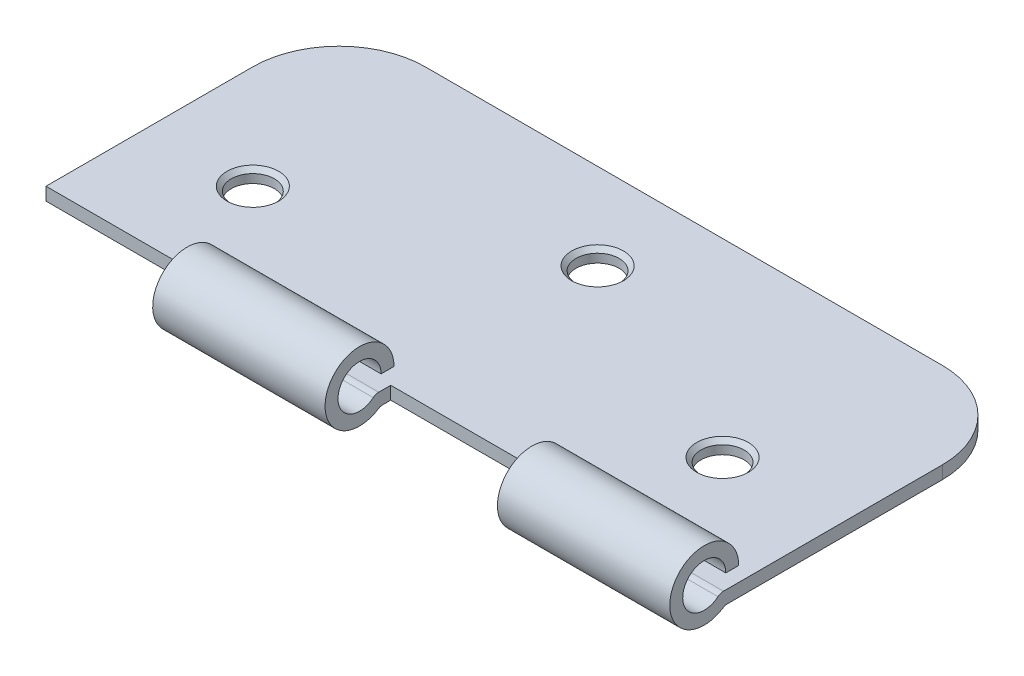
ISO-10303-21;
HEADER;
FILE_DESCRIPTION(('STEP AP214'),'2;1');
FILE_NAME('part.step','',(''),(''),'','','');
FILE_SCHEMA(('AUTOMOTIVE_DESIGN { 1 0 10303 214 1 1 1 1 }'));
ENDSEC;
DATA;
#1=APPLICATION_CONTEXT('core data for automotive mechanical design processes');
#2=APPLICATION_PROTOCOL_DEFINITION('international standard','automotive_design',2000,#1);
#3=PRODUCT_CONTEXT('',#1,'mechanical');
#4=PRODUCT('Part','Part','',(#3));
#5=PRODUCT_RELATED_PRODUCT_CATEGORY('part','',(#4));
#6=PRODUCT_DEFINITION_FORMATION('','',#4);
#7=PRODUCT_DEFINITION_CONTEXT('part definition',#1,'design');
#8=PRODUCT_DEFINITION('design','',#6,#7);
#9=PRODUCT_DEFINITION_SHAPE('','',#8);
#10=(LENGTH_UNIT() NAMED_UNIT(*) SI_UNIT(.MILLI.,.METRE.));
#11=(NAMED_UNIT(*) PLANE_ANGLE_UNIT() SI_UNIT($,.RADIAN.));
#12=(NAMED_UNIT(*) SI_UNIT($,.STERADIAN.) SOLID_ANGLE_UNIT());
#13=UNCERTAINTY_MEASURE_WITH_UNIT(LENGTH_MEASURE(1.E-05),#10,'distance_accuracy_value','');
#14=(GEOMETRIC_REPRESENTATION_CONTEXT(3) GLOBAL_UNCERTAINTY_ASSIGNED_CONTEXT((#13)) GLOBAL_UNIT_ASSIGNED_CONTEXT((#10,
#11,#12)) REPRESENTATION_CONTEXT('',''));
#15=CARTESIAN_POINT('',(0.,0.,0.));
#16=DIRECTION('',(0.,0.,1.));
#17=DIRECTION('',(1.,0.,0.));
#18=AXIS2_PLACEMENT_3D('',#15,#16,#17);
#19=CARTESIAN_POINT('',(-40.,1.5,17.));
#20=DIRECTION('',(0.,0.,-1.));
#21=DIRECTION('',(-1.,0.,0.));
#22=AXIS2_PLACEMENT_3D('',#19,#20,#21);
#23=PLANE('',#22);
#24=DIRECTION('',(0.,1.,0.));
#25=VECTOR('',#24,1.);
#26=CARTESIAN_POINT('',(-20.,1.5,17.));
#27=LINE('',#26,#25);
#28=CARTESIAN_POINT('',(-20.,0.,17.));
#29=VERTEX_POINT('',#28);
#30=CARTESIAN_POINT('',(-20.,1.5,17.));
#31=VERTEX_POINT('',#30);
#32=EDGE_CURVE('E65',#29,#31,#27,.T.);
#33=ORIENTED_EDGE('',*,*,#32,.T.);
#34=DIRECTION('',(1.,0.,0.));
#35=VECTOR('',#34,1.);
#36=CARTESIAN_POINT('',(-40.,1.5,17.));
#37=LINE('',#36,#35);
#38=CARTESIAN_POINT('',(-40.,1.5,17.));
#39=VERTEX_POINT('',#38);
#40=EDGE_CURVE('E316',#39,#31,#37,.T.);
#41=ORIENTED_EDGE('',*,*,#40,.F.);
#42=DIRECTION('',(0.,-1.,0.));
#43=VECTOR('',#42,1.);
#44=CARTESIAN_POINT('',(-40.,1.5,17.));
#45=LINE('',#44,#43);
#46=CARTESIAN_POINT('',(-40.,0.,17.));
#47=VERTEX_POINT('',#46);
#48=EDGE_CURVE('E318',#39,#47,#45,.T.);
#49=ORIENTED_EDGE('',*,*,#48,.T.);
#50=DIRECTION('',(1.,0.,0.));
#51=VECTOR('',#50,1.);
#52=CARTESIAN_POINT('',(-40.,0.,17.));
#53=LINE('',#52,#51);
#54=EDGE_CURVE('E308',#47,#29,#53,.T.);
#55=ORIENTED_EDGE('',*,*,#54,.T.);
#56=EDGE_LOOP('',(#33,#41,#49,#55));
#57=FACE_BOUND('',#56,.T.);
#58=ADVANCED_FACE('F41',(#57),#23,.F.);
#59=CARTESIAN_POINT('',(0.,1.5,17.));
#60=VERTEX_POINT('',#59);
#61=CARTESIAN_POINT('',(20.,1.5,17.));
#62=VERTEX_POINT('',#61);
#63=EDGE_CURVE('E57',#60,#62,#37,.T.);
#64=ORIENTED_EDGE('',*,*,#63,.F.);
#65=DIRECTION('',(0.,1.,0.));
#66=VECTOR('',#65,1.);
#67=CARTESIAN_POINT('',(0.,1.5,17.));
#68=LINE('',#67,#66);
#69=CARTESIAN_POINT('',(0.,0.,17.));
#70=VERTEX_POINT('',#69);
#71=EDGE_CURVE('E229',#70,#60,#68,.T.);
#72=ORIENTED_EDGE('',*,*,#71,.F.);
#73=CARTESIAN_POINT('',(20.,0.,17.));
#74=VERTEX_POINT('',#73);
#75=EDGE_CURVE('E329',#70,#74,#53,.T.);
#76=ORIENTED_EDGE('',*,*,#75,.T.);
#77=DIRECTION('',(0.,1.,0.));
#78=VECTOR('',#77,1.);
#79=CARTESIAN_POINT('',(20.,1.5,17.));
#80=LINE('',#79,#78);
#81=EDGE_CURVE('E259',#74,#62,#80,.T.);
#82=ORIENTED_EDGE('',*,*,#81,.T.);
#83=EDGE_LOOP('',(#64,#72,#76,#82));
#84=FACE_BOUND('',#83,.T.);
#85=ADVANCED_FACE('F385',(#84),#23,.F.);
#86=CARTESIAN_POINT('',(40.,1.5,-6.99999999999993));
#87=DIRECTION('',(-1.,0.,0.));
#88=DIRECTION('',(0.,0.,1.));
#89=AXIS2_PLACEMENT_3D('',#86,#87,#88);
#90=PLANE('',#89);
#91=DIRECTION('',(0.,0.,-1.));
#92=VECTOR('',#91,1.);
#93=CARTESIAN_POINT('',(40.,0.,-6.99999999999993));
#94=LINE('',#93,#92);
#95=CARTESIAN_POINT('',(40.,0.,17.9076535855259));
#96=VERTEX_POINT('',#95);
#97=CARTESIAN_POINT('',(40.,0.,-6.99999999999993));
#98=VERTEX_POINT('',#97);
#99=EDGE_CURVE('E292',#96,#98,#94,.T.);
#100=ORIENTED_EDGE('',*,*,#99,.T.);
#101=DIRECTION('',(0.,-1.,0.));
#102=VECTOR('',#101,1.);
#103=CARTESIAN_POINT('',(40.,1.5,-6.99999999999993));
#104=LINE('',#103,#102);
#105=CARTESIAN_POINT('',(40.,1.5,-6.99999999999993));
#106=VERTEX_POINT('',#105);
#107=EDGE_CURVE('E342',#106,#98,#104,.T.);
#108=ORIENTED_EDGE('',*,*,#107,.F.);
#109=DIRECTION('',(0.,0.,-1.));
#110=VECTOR('',#109,1.);
#111=CARTESIAN_POINT('',(40.,1.5,-6.99999999999993));
#112=LINE('',#111,#110);
#113=CARTESIAN_POINT('',(40.,1.5,18.3935383088046));
#114=VERTEX_POINT('',#113);
#115=EDGE_CURVE('E304',#114,#106,#112,.T.);
#116=ORIENTED_EDGE('',*,*,#115,.F.);
#117=CARTESIAN_POINT('',(40.,0.5,18.3935383088046));
#118=DIRECTION('',(1.,0.,0.));
#119=DIRECTION('',(0.,0.,-1.));
#120=AXIS2_PLACEMENT_3D('',#117,#118,#119);
#121=CIRCLE('',#120,1.);
#122=CARTESIAN_POINT('',(40.,1.27137881689556,19.0299145503825));
#123=VERTEX_POINT('',#122);
#124=EDGE_CURVE('E279',#114,#123,#121,.T.);
#125=ORIENTED_EDGE('',*,*,#124,.T.);
#126=CARTESIAN_POINT('',(40.,3.19982585913445,20.6208551543272));
#127=DIRECTION('',(-1.,0.,0.));
#128=DIRECTION('',(0.,0.,-1.));
#129=AXIS2_PLACEMENT_3D('',#126,#127,#128);
#130=CIRCLE('',#129,2.5);
#131=CARTESIAN_POINT('',(40.,3.19982585913445,18.1208551543272));
#132=VERTEX_POINT('',#131);
#133=EDGE_CURVE('E282',#123,#132,#130,.T.);
#134=ORIENTED_EDGE('',*,*,#133,.T.);
#135=DIRECTION('',(0.,0.,-1.));
#136=VECTOR('',#135,1.);
#137=CARTESIAN_POINT('',(40.,3.19982585913445,18.1208551543272));
#138=LINE('',#137,#136);
#139=CARTESIAN_POINT('',(40.,3.19982585913445,16.6208551543272));
#140=VERTEX_POINT('',#139);
#141=EDGE_CURVE('E285',#132,#140,#138,.T.);
#142=ORIENTED_EDGE('',*,*,#141,.T.);
#143=CARTESIAN_POINT('',(40.,3.19982585913445,20.6208551543272));
#144=DIRECTION('',(1.,0.,0.));
#145=DIRECTION('',(0.,0.,-1.));
#146=AXIS2_PLACEMENT_3D('',#143,#144,#145);
#147=CIRCLE('',#146,4.);
#148=CARTESIAN_POINT('',(40.,-0.160034828173112,18.4502938992862));
#149=VERTEX_POINT('',#148);
#150=EDGE_CURVE('E256',#140,#149,#147,.T.);
#151=ORIENTED_EDGE('',*,*,#150,.T.);
#152=CARTESIAN_POINT('',(40.,-1.,17.9076535855259));
#153=DIRECTION('',(-1.,0.,0.));
#154=DIRECTION('',(0.,0.,-1.));
#155=AXIS2_PLACEMENT_3D('',#152,#153,#154);
#156=CIRCLE('',#155,1.);
#157=EDGE_CURVE('E244',#149,#96,#156,.T.);
#158=ORIENTED_EDGE('',*,*,#157,.T.);
#159=EDGE_LOOP('',(#100,#108,#116,#125,#134,#142,#151,#158));
#160=FACE_BOUND('',#159,.T.);
#161=ADVANCED_FACE('F391',(#160),#90,.F.);
#162=CARTESIAN_POINT('',(30.,1.5,-7.));
#163=DIRECTION('',(0.,-1.,0.));
#164=DIRECTION('',(0.,0.,-1.));
#165=AXIS2_PLACEMENT_3D('',#162,#163,#164);
#166=CYLINDRICAL_SURFACE('',#165,10.);
#167=CARTESIAN_POINT('',(30.,0.,-7.));
#168=DIRECTION('',(0.,1.,0.));
#169=DIRECTION('',(0.,0.,-1.));
#170=AXIS2_PLACEMENT_3D('',#167,#168,#169);
#171=CIRCLE('',#170,10.);
#172=CARTESIAN_POINT('',(29.9999999999999,0.,-17.));
#173=VERTEX_POINT('',#172);
#174=EDGE_CURVE('E321',#98,#173,#171,.T.);
#175=ORIENTED_EDGE('',*,*,#174,.T.);
#176=DIRECTION('',(0.,-1.,0.));
#177=VECTOR('',#176,1.);
#178=CARTESIAN_POINT('',(29.9999999999999,1.5,-17.));
#179=LINE('',#178,#177);
#180=CARTESIAN_POINT('',(29.9999999999999,1.5,-17.));
#181=VERTEX_POINT('',#180);
#182=EDGE_CURVE('E339',#181,#173,#179,.T.);
#183=ORIENTED_EDGE('',*,*,#182,.F.);
#184=CARTESIAN_POINT('',(30.,1.5,-7.));
#185=DIRECTION('',(0.,1.,0.));
#186=DIRECTION('',(0.,0.,-1.));
#187=AXIS2_PLACEMENT_3D('',#184,#185,#186);
#188=CIRCLE('',#187,10.);
#189=EDGE_CURVE('E307',#106,#181,#188,.T.);
#190=ORIENTED_EDGE('',*,*,#189,.F.);
#191=ORIENTED_EDGE('',*,*,#107,.T.);
#192=EDGE_LOOP('',(#175,#183,#190,#191));
#193=FACE_BOUND('',#192,.T.);
#194=ADVANCED_FACE('F407',(#193),#166,.T.);
#195=CARTESIAN_POINT('',(-29.9999999999999,1.5,-17.));
#196=DIRECTION('',(0.,0.,1.));
#197=DIRECTION('',(1.,0.,0.));
#198=AXIS2_PLACEMENT_3D('',#195,#196,#197);
#199=PLANE('',#198);
#200=DIRECTION('',(-1.,0.,0.));
#201=VECTOR('',#200,1.);
#202=CARTESIAN_POINT('',(-29.9999999999999,0.,-17.));
#203=LINE('',#202,#201);
#204=CARTESIAN_POINT('',(-29.9999999999999,0.,-17.));
#205=VERTEX_POINT('',#204);
#206=EDGE_CURVE('E323',#173,#205,#203,.T.);
#207=ORIENTED_EDGE('',*,*,#206,.T.);
#208=DIRECTION('',(0.,-1.,0.));
#209=VECTOR('',#208,1.);
#210=CARTESIAN_POINT('',(-29.9999999999999,1.5,-17.));
#211=LINE('',#210,#209);
#212=CARTESIAN_POINT('',(-29.9999999999999,1.5,-17.));
#213=VERTEX_POINT('',#212);
#214=EDGE_CURVE('E336',#213,#205,#211,.T.);
#215=ORIENTED_EDGE('',*,*,#214,.F.);
#216=DIRECTION('',(-1.,0.,0.));
#217=VECTOR('',#216,1.);
#218=CARTESIAN_POINT('',(-29.9999999999999,1.5,-17.));
#219=LINE('',#218,#217);
#220=EDGE_CURVE('E310',#181,#213,#219,.T.);
#221=ORIENTED_EDGE('',*,*,#220,.F.);
#222=ORIENTED_EDGE('',*,*,#182,.T.);
#223=EDGE_LOOP('',(#207,#215,#221,#222));
#224=FACE_BOUND('',#223,.T.);
#225=ADVANCED_FACE('F403',(#224),#199,.F.);
#226=CARTESIAN_POINT('',(-30.,1.5,-7.));
#227=DIRECTION('',(0.,-1.,0.));
#228=DIRECTION('',(0.,0.,-1.));
#229=AXIS2_PLACEMENT_3D('',#226,#227,#228);
#230=CYLINDRICAL_SURFACE('',#229,10.);
#231=CARTESIAN_POINT('',(-30.,0.,-7.));
#232=DIRECTION('',(0.,1.,0.));
#233=DIRECTION('',(0.,0.,1.));
#234=AXIS2_PLACEMENT_3D('',#231,#232,#233);
#235=CIRCLE('',#234,10.);
#236=CARTESIAN_POINT('',(-40.,0.,-6.99999999999993));
#237=VERTEX_POINT('',#236);
#238=EDGE_CURVE('E325',#205,#237,#235,.T.);
#239=ORIENTED_EDGE('',*,*,#238,.T.);
#240=DIRECTION('',(0.,-1.,0.));
#241=VECTOR('',#240,1.);
#242=CARTESIAN_POINT('',(-40.,1.5,-6.99999999999993));
#243=LINE('',#242,#241);
#244=CARTESIAN_POINT('',(-40.,1.5,-6.99999999999993));
#245=VERTEX_POINT('',#244);
#246=EDGE_CURVE('E333',#245,#237,#243,.T.);
#247=ORIENTED_EDGE('',*,*,#246,.F.);
#248=CARTESIAN_POINT('',(-30.,1.5,-7.));
#249=DIRECTION('',(0.,1.,0.));
#250=DIRECTION('',(0.,0.,1.));
#251=AXIS2_PLACEMENT_3D('',#248,#249,#250);
#252=CIRCLE('',#251,10.);
#253=EDGE_CURVE('E312',#213,#245,#252,.T.);
#254=ORIENTED_EDGE('',*,*,#253,.F.);
#255=ORIENTED_EDGE('',*,*,#214,.T.);
#256=EDGE_LOOP('',(#239,#247,#254,#255));
#257=FACE_BOUND('',#256,.T.);
#258=ADVANCED_FACE('F399',(#257),#230,.T.);
#259=CARTESIAN_POINT('',(-40.,1.5,-6.99999999999993));
#260=DIRECTION('',(1.,0.,0.));
#261=DIRECTION('',(0.,0.,-1.));
#262=AXIS2_PLACEMENT_3D('',#259,#260,#261);
#263=PLANE('',#262);
#264=DIRECTION('',(0.,0.,1.));
#265=VECTOR('',#264,1.);
#266=CARTESIAN_POINT('',(-40.,0.,-6.99999999999993));
#267=LINE('',#266,#265);
#268=EDGE_CURVE('E327',#237,#47,#267,.T.);
#269=ORIENTED_EDGE('',*,*,#268,.T.);
#270=ORIENTED_EDGE('',*,*,#48,.F.);
#271=DIRECTION('',(0.,0.,1.));
#272=VECTOR('',#271,1.);
#273=CARTESIAN_POINT('',(-40.,1.5,-6.99999999999993));
#274=LINE('',#273,#272);
#275=EDGE_CURVE('E314',#245,#39,#274,.T.);
#276=ORIENTED_EDGE('',*,*,#275,.F.);
#277=ORIENTED_EDGE('',*,*,#246,.T.);
#278=EDGE_LOOP('',(#269,#270,#276,#277));
#279=FACE_BOUND('',#278,.T.);
#280=ADVANCED_FACE('F395',(#279),#263,.F.);
#281=CARTESIAN_POINT('',(-30.,1.5,-7.));
#282=DIRECTION('',(0.,1.,0.));
#283=DIRECTION('',(0.,0.,1.));
#284=AXIS2_PLACEMENT_3D('',#281,#282,#283);
#285=PLANE('',#284);
#286=CARTESIAN_POINT('',(26.5,1.5,5.));
#287=DIRECTION('',(0.,1.,0.));
#288=DIRECTION('',(0.,0.,1.));
#289=AXIS2_PLACEMENT_3D('',#286,#287,#288);
#290=CIRCLE('',#289,3.00000000000001);
#291=CARTESIAN_POINT('',(26.5,1.5,8.00000000000002));
#292=VERTEX_POINT('',#291);
#293=EDGE_CURVE('E362',#292,#292,#290,.F.);
#294=ORIENTED_EDGE('',*,*,#293,.T.);
#295=EDGE_LOOP('',(#294));
#296=FACE_BOUND('',#295,.T.);
#297=CARTESIAN_POINT('',(0.,1.5,-7.));
#298=DIRECTION('',(0.,1.,0.));
#299=DIRECTION('',(0.,0.,1.));
#300=AXIS2_PLACEMENT_3D('',#297,#298,#299);
#301=CIRCLE('',#300,2.99999999999997);
#302=CARTESIAN_POINT('',(0.,1.5,-4.00000000000003));
#303=VERTEX_POINT('',#302);
#304=EDGE_CURVE('E359',#303,#303,#301,.F.);
#305=ORIENTED_EDGE('',*,*,#304,.T.);
#306=EDGE_LOOP('',(#305));
#307=FACE_BOUND('',#306,.T.);
#308=CARTESIAN_POINT('',(-28.,1.5,5.));
#309=DIRECTION('',(0.,1.,0.));
#310=DIRECTION('',(0.,0.,1.));
#311=AXIS2_PLACEMENT_3D('',#308,#309,#310);
#312=CIRCLE('',#311,3.00000000000001);
#313=CARTESIAN_POINT('',(-28.,1.5,8.00000000000002));
#314=VERTEX_POINT('',#313);
#315=EDGE_CURVE('E356',#314,#314,#312,.F.);
#316=ORIENTED_EDGE('',*,*,#315,.T.);
#317=EDGE_LOOP('',(#316));
#318=FACE_BOUND('',#317,.T.);
#319=ORIENTED_EDGE('',*,*,#115,.T.);
#320=ORIENTED_EDGE('',*,*,#189,.T.);
#321=ORIENTED_EDGE('',*,*,#220,.T.);
#322=ORIENTED_EDGE('',*,*,#253,.T.);
#323=ORIENTED_EDGE('',*,*,#275,.T.);
#324=ORIENTED_EDGE('',*,*,#40,.T.);
#325=DIRECTION('',(0.,0.,1.));
#326=VECTOR('',#325,1.);
#327=CARTESIAN_POINT('',(-20.,1.5,17.));
#328=LINE('',#327,#326);
#329=CARTESIAN_POINT('',(-20.,1.5,18.3935383088046));
#330=VERTEX_POINT('',#329);
#331=EDGE_CURVE('E212',#31,#330,#328,.T.);
#332=ORIENTED_EDGE('',*,*,#331,.T.);
#333=DIRECTION('',(1.,0.,0.));
#334=VECTOR('',#333,1.);
#335=CARTESIAN_POINT('',(-20.,1.5,18.3935383088046));
#336=LINE('',#335,#334);
#337=CARTESIAN_POINT('',(0.,1.5,18.3935383088046));
#338=VERTEX_POINT('',#337);
#339=EDGE_CURVE('E192',#330,#338,#336,.T.);
#340=ORIENTED_EDGE('',*,*,#339,.T.);
#341=DIRECTION('',(0.,0.,1.));
#342=VECTOR('',#341,1.);
#343=CARTESIAN_POINT('',(0.,1.5,17.));
#344=LINE('',#343,#342);
#345=EDGE_CURVE('E232',#60,#338,#344,.T.);
#346=ORIENTED_EDGE('',*,*,#345,.F.);
#347=ORIENTED_EDGE('',*,*,#63,.T.);
#348=DIRECTION('',(0.,0.,1.));
#349=VECTOR('',#348,1.);
#350=CARTESIAN_POINT('',(20.,1.5,17.));
#351=LINE('',#350,#349);
#352=CARTESIAN_POINT('',(20.,1.5,18.3935383088046));
#353=VERTEX_POINT('',#352);
#354=EDGE_CURVE('E261',#62,#353,#351,.T.);
#355=ORIENTED_EDGE('',*,*,#354,.T.);
#356=DIRECTION('',(1.,0.,0.));
#357=VECTOR('',#356,1.);
#358=CARTESIAN_POINT('',(20.,1.5,18.3935383088046));
#359=LINE('',#358,#357);
#360=EDGE_CURVE('E299',#353,#114,#359,.T.);
#361=ORIENTED_EDGE('',*,*,#360,.T.);
#362=EDGE_LOOP('',(#319,#320,#321,#322,#323,#324,#332,#340,#346,#347,#355,#361));
#363=FACE_BOUND('',#362,.T.);
#364=ADVANCED_FACE('F398',(#296,#307,#318,#363),#285,.T.);
#365=CARTESIAN_POINT('',(-30.,0.,-7.));
#366=DIRECTION('',(0.,1.,0.));
#367=DIRECTION('',(0.,0.,1.));
#368=AXIS2_PLACEMENT_3D('',#365,#366,#367);
#369=PLANE('',#368);
#370=CARTESIAN_POINT('',(-28.,0.,5.));
#371=DIRECTION('',(0.,1.,0.));
#372=DIRECTION('',(0.,0.,1.));
#373=AXIS2_PLACEMENT_3D('',#370,#371,#372);
#374=CIRCLE('',#373,2.5);
#375=CARTESIAN_POINT('',(-28.,0.,7.5));
#376=VERTEX_POINT('',#375);
#377=EDGE_CURVE('E227',#376,#376,#374,.T.);
#378=ORIENTED_EDGE('',*,*,#377,.T.);
#379=EDGE_LOOP('',(#378));
#380=FACE_BOUND('',#379,.T.);
#381=CARTESIAN_POINT('',(0.,0.,-7.));
#382=DIRECTION('',(0.,1.,0.));
#383=DIRECTION('',(0.,0.,1.));
#384=AXIS2_PLACEMENT_3D('',#381,#382,#383);
#385=CIRCLE('',#384,2.5);
#386=CARTESIAN_POINT('',(0.,0.,-4.5));
#387=VERTEX_POINT('',#386);
#388=EDGE_CURVE('E349',#387,#387,#385,.T.);
#389=ORIENTED_EDGE('',*,*,#388,.T.);
#390=EDGE_LOOP('',(#389));
#391=FACE_BOUND('',#390,.T.);
#392=CARTESIAN_POINT('',(26.5,0.,5.));
#393=DIRECTION('',(0.,1.,0.));
#394=DIRECTION('',(0.,0.,1.));
#395=AXIS2_PLACEMENT_3D('',#392,#393,#394);
#396=CIRCLE('',#395,2.5);
#397=CARTESIAN_POINT('',(26.5,0.,7.5));
#398=VERTEX_POINT('',#397);
#399=EDGE_CURVE('E346',#398,#398,#396,.T.);
#400=ORIENTED_EDGE('',*,*,#399,.T.);
#401=EDGE_LOOP('',(#400));
#402=FACE_BOUND('',#401,.T.);
#403=ORIENTED_EDGE('',*,*,#99,.F.);
#404=DIRECTION('',(1.,0.,0.));
#405=VECTOR('',#404,1.);
#406=CARTESIAN_POINT('',(20.,0.,17.9076535855259));
#407=LINE('',#406,#405);
#408=CARTESIAN_POINT('',(20.,0.,17.9076535855259));
#409=VERTEX_POINT('',#408);
#410=EDGE_CURVE('E276',#409,#96,#407,.T.);
#411=ORIENTED_EDGE('',*,*,#410,.F.);
#412=DIRECTION('',(0.,0.,-1.));
#413=VECTOR('',#412,1.);
#414=CARTESIAN_POINT('',(20.,0.,17.));
#415=LINE('',#414,#413);
#416=EDGE_CURVE('E255',#409,#74,#415,.T.);
#417=ORIENTED_EDGE('',*,*,#416,.T.);
#418=ORIENTED_EDGE('',*,*,#75,.F.);
#419=DIRECTION('',(0.,0.,-1.));
#420=VECTOR('',#419,1.);
#421=CARTESIAN_POINT('',(0.,0.,17.));
#422=LINE('',#421,#420);
#423=CARTESIAN_POINT('',(0.,0.,17.9076535855259));
#424=VERTEX_POINT('',#423);
#425=EDGE_CURVE('E187',#424,#70,#422,.T.);
#426=ORIENTED_EDGE('',*,*,#425,.F.);
#427=DIRECTION('',(1.,0.,0.));
#428=VECTOR('',#427,1.);
#429=CARTESIAN_POINT('',(-20.,0.,17.9076535855259));
#430=LINE('',#429,#428);
#431=CARTESIAN_POINT('',(-20.,0.,17.9076535855259));
#432=VERTEX_POINT('',#431);
#433=EDGE_CURVE('E181',#432,#424,#430,.T.);
#434=ORIENTED_EDGE('',*,*,#433,.F.);
#435=DIRECTION('',(0.,0.,-1.));
#436=VECTOR('',#435,1.);
#437=CARTESIAN_POINT('',(-20.,0.,17.));
#438=LINE('',#437,#436);
#439=EDGE_CURVE('E185',#432,#29,#438,.T.);
#440=ORIENTED_EDGE('',*,*,#439,.T.);
#441=ORIENTED_EDGE('',*,*,#54,.F.);
#442=ORIENTED_EDGE('',*,*,#268,.F.);
#443=ORIENTED_EDGE('',*,*,#238,.F.);
#444=ORIENTED_EDGE('',*,*,#206,.F.);
#445=ORIENTED_EDGE('',*,*,#174,.F.);
#446=EDGE_LOOP('',(#403,#411,#417,#418,#426,#434,#440,#441,#442,#443,#444,#445));
#447=FACE_BOUND('',#446,.T.);
#448=ADVANCED_FACE('F183',(#380,#391,#402,#447),#369,.F.);
#449=CARTESIAN_POINT('',(20.,-1.,17.9076535855259));
#450=DIRECTION('',(1.,0.,0.));
#451=DIRECTION('',(0.,0.,-1.));
#452=AXIS2_PLACEMENT_3D('',#449,#450,#451);
#453=CYLINDRICAL_SURFACE('',#452,1.);
#454=ORIENTED_EDGE('',*,*,#157,.F.);
#455=DIRECTION('',(1.,0.,0.));
#456=VECTOR('',#455,1.);
#457=CARTESIAN_POINT('',(20.,-0.160034828173112,18.4502938992862));
#458=LINE('',#457,#456);
#459=CARTESIAN_POINT('',(20.,-0.160034828173112,18.4502938992862));
#460=VERTEX_POINT('',#459);
#461=EDGE_CURVE('E290',#460,#149,#458,.T.);
#462=ORIENTED_EDGE('',*,*,#461,.F.);
#463=CARTESIAN_POINT('',(20.,-1.,17.9076535855259));
#464=DIRECTION('',(-1.,0.,0.));
#465=DIRECTION('',(0.,0.,-1.));
#466=AXIS2_PLACEMENT_3D('',#463,#464,#465);
#467=CIRCLE('',#466,1.);
#468=EDGE_CURVE('E252',#460,#409,#467,.T.);
#469=ORIENTED_EDGE('',*,*,#468,.T.);
#470=ORIENTED_EDGE('',*,*,#410,.T.);
#471=EDGE_LOOP('',(#454,#462,#469,#470));
#472=FACE_BOUND('',#471,.T.);
#473=ADVANCED_FACE('F429',(#472),#453,.F.);
#474=CARTESIAN_POINT('',(20.,3.19982585913445,20.6208551543272));
#475=DIRECTION('',(1.,0.,0.));
#476=DIRECTION('',(0.,0.,-1.));
#477=AXIS2_PLACEMENT_3D('',#474,#475,#476);
#478=CYLINDRICAL_SURFACE('',#477,4.);
#479=ORIENTED_EDGE('',*,*,#150,.F.);
#480=DIRECTION('',(1.,0.,0.));
#481=VECTOR('',#480,1.);
#482=CARTESIAN_POINT('',(20.,3.19982585913445,16.6208551543272));
#483=LINE('',#482,#481);
#484=CARTESIAN_POINT('',(20.,3.19982585913445,16.6208551543272));
#485=VERTEX_POINT('',#484);
#486=EDGE_CURVE('E293',#485,#140,#483,.T.);
#487=ORIENTED_EDGE('',*,*,#486,.F.);
#488=CARTESIAN_POINT('',(20.,3.19982585913445,20.6208551543272));
#489=DIRECTION('',(1.,0.,0.));
#490=DIRECTION('',(0.,0.,-1.));
#491=AXIS2_PLACEMENT_3D('',#488,#489,#490);
#492=CIRCLE('',#491,4.);
#493=EDGE_CURVE('E273',#485,#460,#492,.T.);
#494=ORIENTED_EDGE('',*,*,#493,.T.);
#495=ORIENTED_EDGE('',*,*,#461,.T.);
#496=EDGE_LOOP('',(#479,#487,#494,#495));
#497=FACE_BOUND('',#496,.T.);
#498=ADVANCED_FACE('F438',(#497),#478,.T.);
#499=CARTESIAN_POINT('',(20.,3.19982585913445,18.1208551543272));
#500=DIRECTION('',(0.,-1.,0.));
#501=DIRECTION('',(0.,0.,-1.));
#502=AXIS2_PLACEMENT_3D('',#499,#500,#501);
#503=PLANE('',#502);
#504=ORIENTED_EDGE('',*,*,#141,.F.);
#505=DIRECTION('',(1.,0.,0.));
#506=VECTOR('',#505,1.);
#507=CARTESIAN_POINT('',(20.,3.19982585913445,18.1208551543272));
#508=LINE('',#507,#506);
#509=CARTESIAN_POINT('',(20.,3.19982585913445,18.1208551543272));
#510=VERTEX_POINT('',#509);
#511=EDGE_CURVE('E295',#510,#132,#508,.T.);
#512=ORIENTED_EDGE('',*,*,#511,.F.);
#513=DIRECTION('',(0.,0.,-1.));
#514=VECTOR('',#513,1.);
#515=CARTESIAN_POINT('',(20.,3.19982585913445,18.1208551543272));
#516=LINE('',#515,#514);
#517=EDGE_CURVE('E270',#510,#485,#516,.T.);
#518=ORIENTED_EDGE('',*,*,#517,.T.);
#519=ORIENTED_EDGE('',*,*,#486,.T.);
#520=EDGE_LOOP('',(#504,#512,#518,#519));
#521=FACE_BOUND('',#520,.T.);
#522=ADVANCED_FACE('F441',(#521),#503,.T.);
#523=CARTESIAN_POINT('',(20.,3.19982585913445,20.6208551543272));
#524=DIRECTION('',(1.,0.,0.));
#525=DIRECTION('',(0.,0.,-1.));
#526=AXIS2_PLACEMENT_3D('',#523,#524,#525);
#527=CYLINDRICAL_SURFACE('',#526,2.5);
#528=ORIENTED_EDGE('',*,*,#133,.F.);
#529=DIRECTION('',(1.,0.,0.));
#530=VECTOR('',#529,1.);
#531=CARTESIAN_POINT('',(20.,1.27137881689556,19.0299145503825));
#532=LINE('',#531,#530);
#533=CARTESIAN_POINT('',(20.,1.27137881689556,19.0299145503825));
#534=VERTEX_POINT('',#533);
#535=EDGE_CURVE('E297',#534,#123,#532,.T.);
#536=ORIENTED_EDGE('',*,*,#535,.F.);
#537=CARTESIAN_POINT('',(20.,3.19982585913445,20.6208551543272));
#538=DIRECTION('',(-1.,0.,0.));
#539=DIRECTION('',(0.,0.,-1.));
#540=AXIS2_PLACEMENT_3D('',#537,#538,#539);
#541=CIRCLE('',#540,2.5);
#542=EDGE_CURVE('E267',#534,#510,#541,.T.);
#543=ORIENTED_EDGE('',*,*,#542,.T.);
#544=ORIENTED_EDGE('',*,*,#511,.T.);
#545=EDGE_LOOP('',(#528,#536,#543,#544));
#546=FACE_BOUND('',#545,.T.);
#547=ADVANCED_FACE('F446',(#546),#527,.F.);
#548=CARTESIAN_POINT('',(20.,0.5,18.3935383088046));
#549=DIRECTION('',(1.,0.,0.));
#550=DIRECTION('',(0.,0.,-1.));
#551=AXIS2_PLACEMENT_3D('',#548,#549,#550);
#552=CYLINDRICAL_SURFACE('',#551,1.);
#553=ORIENTED_EDGE('',*,*,#124,.F.);
#554=ORIENTED_EDGE('',*,*,#360,.F.);
#555=CARTESIAN_POINT('',(20.,0.5,18.3935383088046));
#556=DIRECTION('',(1.,0.,0.));
#557=DIRECTION('',(0.,0.,-1.));
#558=AXIS2_PLACEMENT_3D('',#555,#556,#557);
#559=CIRCLE('',#558,1.);
#560=EDGE_CURVE('E264',#353,#534,#559,.T.);
#561=ORIENTED_EDGE('',*,*,#560,.T.);
#562=ORIENTED_EDGE('',*,*,#535,.T.);
#563=EDGE_LOOP('',(#553,#554,#561,#562));
#564=FACE_BOUND('',#563,.T.);
#565=ADVANCED_FACE('F449',(#564),#552,.T.);
#566=CARTESIAN_POINT('',(20.,-1.,17.9076535855259));
#567=DIRECTION('',(1.,0.,0.));
#568=DIRECTION('',(0.,0.,-1.));
#569=AXIS2_PLACEMENT_3D('',#566,#567,#568);
#570=PLANE('',#569);
#571=ORIENTED_EDGE('',*,*,#468,.F.);
#572=ORIENTED_EDGE('',*,*,#493,.F.);
#573=ORIENTED_EDGE('',*,*,#517,.F.);
#574=ORIENTED_EDGE('',*,*,#542,.F.);
#575=ORIENTED_EDGE('',*,*,#560,.F.);
#576=ORIENTED_EDGE('',*,*,#354,.F.);
#577=ORIENTED_EDGE('',*,*,#81,.F.);
#578=ORIENTED_EDGE('',*,*,#416,.F.);
#579=EDGE_LOOP('',(#571,#572,#573,#574,#575,#576,#577,#578));
#580=FACE_BOUND('',#579,.T.);
#581=ADVANCED_FACE('F433',(#580),#570,.F.);
#582=CARTESIAN_POINT('',(-20.,-1.,17.9076535855259));
#583=DIRECTION('',(1.,0.,0.));
#584=DIRECTION('',(0.,0.,-1.));
#585=AXIS2_PLACEMENT_3D('',#582,#583,#584);
#586=CYLINDRICAL_SURFACE('',#585,1.);
#587=CARTESIAN_POINT('',(0.,-1.,17.9076535855259));
#588=DIRECTION('',(-1.,0.,0.));
#589=DIRECTION('',(0.,0.,-1.));
#590=AXIS2_PLACEMENT_3D('',#587,#588,#589);
#591=CIRCLE('',#590,1.);
#592=CARTESIAN_POINT('',(0.,-0.160034828173112,18.4502938992862));
#593=VERTEX_POINT('',#592);
#594=EDGE_CURVE('E225',#593,#424,#591,.T.);
#595=ORIENTED_EDGE('',*,*,#594,.F.);
#596=DIRECTION('',(1.,0.,0.));
#597=VECTOR('',#596,1.);
#598=CARTESIAN_POINT('',(-20.,-0.160034828173112,18.4502938992862));
#599=LINE('',#598,#597);
#600=CARTESIAN_POINT('',(-20.,-0.160034828173112,18.4502938992862));
#601=VERTEX_POINT('',#600);
#602=EDGE_CURVE('E204',#601,#593,#599,.T.);
#603=ORIENTED_EDGE('',*,*,#602,.F.);
#604=CARTESIAN_POINT('',(-20.,-1.,17.9076535855259));
#605=DIRECTION('',(-1.,0.,0.));
#606=DIRECTION('',(0.,0.,-1.));
#607=AXIS2_PLACEMENT_3D('',#604,#605,#606);
#608=CIRCLE('',#607,1.);
#609=EDGE_CURVE('E199',#601,#432,#608,.T.);
#610=ORIENTED_EDGE('',*,*,#609,.T.);
#611=ORIENTED_EDGE('',*,*,#433,.T.);
#612=EDGE_LOOP('',(#595,#603,#610,#611));
#613=FACE_BOUND('',#612,.T.);
#614=ADVANCED_FACE('F203',(#613),#586,.F.);
#615=CARTESIAN_POINT('',(-20.,3.19982585913445,20.6208551543272));
#616=DIRECTION('',(1.,0.,0.));
#617=DIRECTION('',(0.,0.,-1.));
#618=AXIS2_PLACEMENT_3D('',#615,#616,#617);
#619=CYLINDRICAL_SURFACE('',#618,4.);
#620=CARTESIAN_POINT('',(0.,3.19982585913445,20.6208551543272));
#621=DIRECTION('',(1.,0.,0.));
#622=DIRECTION('',(0.,0.,-1.));
#623=AXIS2_PLACEMENT_3D('',#620,#621,#622);
#624=CIRCLE('',#623,4.);
#625=CARTESIAN_POINT('',(0.,3.19982585913445,16.6208551543272));
#626=VERTEX_POINT('',#625);
#627=EDGE_CURVE('E205',#626,#593,#624,.T.);
#628=ORIENTED_EDGE('',*,*,#627,.F.);
#629=DIRECTION('',(1.,0.,0.));
#630=VECTOR('',#629,1.);
#631=CARTESIAN_POINT('',(-20.,3.19982585913445,16.6208551543272));
#632=LINE('',#631,#630);
#633=CARTESIAN_POINT('',(-20.,3.19982585913445,16.6208551543272));
#634=VERTEX_POINT('',#633);
#635=EDGE_CURVE('E245',#634,#626,#632,.T.);
#636=ORIENTED_EDGE('',*,*,#635,.F.);
#637=CARTESIAN_POINT('',(-20.,3.19982585913445,20.6208551543272));
#638=DIRECTION('',(1.,0.,0.));
#639=DIRECTION('',(0.,0.,-1.));
#640=AXIS2_PLACEMENT_3D('',#637,#638,#639);
#641=CIRCLE('',#640,4.);
#642=EDGE_CURVE('E193',#634,#601,#641,.T.);
#643=ORIENTED_EDGE('',*,*,#642,.T.);
#644=ORIENTED_EDGE('',*,*,#602,.T.);
#645=EDGE_LOOP('',(#628,#636,#643,#644));
#646=FACE_BOUND('',#645,.T.);
#647=ADVANCED_FACE('F457',(#646),#619,.T.);
#648=CARTESIAN_POINT('',(-20.,3.19982585913445,18.1208551543272));
#649=DIRECTION('',(0.,-1.,0.));
#650=DIRECTION('',(0.,0.,-1.));
#651=AXIS2_PLACEMENT_3D('',#648,#649,#650);
#652=PLANE('',#651);
#653=DIRECTION('',(0.,0.,-1.));
#654=VECTOR('',#653,1.);
#655=CARTESIAN_POINT('',(0.,3.19982585913445,18.1208551543272));
#656=LINE('',#655,#654);
#657=CARTESIAN_POINT('',(0.,3.19982585913445,18.1208551543272));
#658=VERTEX_POINT('',#657);
#659=EDGE_CURVE('E208',#658,#626,#656,.T.);
#660=ORIENTED_EDGE('',*,*,#659,.F.);
#661=DIRECTION('',(1.,0.,0.));
#662=VECTOR('',#661,1.);
#663=CARTESIAN_POINT('',(-20.,3.19982585913445,18.1208551543272));
#664=LINE('',#663,#662);
#665=CARTESIAN_POINT('',(-20.,3.19982585913445,18.1208551543272));
#666=VERTEX_POINT('',#665);
#667=EDGE_CURVE('E247',#666,#658,#664,.T.);
#668=ORIENTED_EDGE('',*,*,#667,.F.);
#669=DIRECTION('',(0.,0.,-1.));
#670=VECTOR('',#669,1.);
#671=CARTESIAN_POINT('',(-20.,3.19982585913445,18.1208551543272));
#672=LINE('',#671,#670);
#673=EDGE_CURVE('E221',#666,#634,#672,.T.);
#674=ORIENTED_EDGE('',*,*,#673,.T.);
#675=ORIENTED_EDGE('',*,*,#635,.T.);
#676=EDGE_LOOP('',(#660,#668,#674,#675));
#677=FACE_BOUND('',#676,.T.);
#678=ADVANCED_FACE('F484',(#677),#652,.T.);
#679=CARTESIAN_POINT('',(-20.,3.19982585913445,20.6208551543272));
#680=DIRECTION('',(1.,0.,0.));
#681=DIRECTION('',(0.,0.,-1.));
#682=AXIS2_PLACEMENT_3D('',#679,#680,#681);
#683=CYLINDRICAL_SURFACE('',#682,2.5);
#684=CARTESIAN_POINT('',(0.,3.19982585913445,20.6208551543272));
#685=DIRECTION('',(-1.,0.,0.));
#686=DIRECTION('',(0.,0.,-1.));
#687=AXIS2_PLACEMENT_3D('',#684,#685,#686);
#688=CIRCLE('',#687,2.5);
#689=CARTESIAN_POINT('',(0.,1.27137881689556,19.0299145503825));
#690=VERTEX_POINT('',#689);
#691=EDGE_CURVE('E238',#690,#658,#688,.T.);
#692=ORIENTED_EDGE('',*,*,#691,.F.);
#693=DIRECTION('',(1.,0.,0.));
#694=VECTOR('',#693,1.);
#695=CARTESIAN_POINT('',(-20.,1.27137881689556,19.0299145503825));
#696=LINE('',#695,#694);
#697=CARTESIAN_POINT('',(-20.,1.27137881689556,19.0299145503825));
#698=VERTEX_POINT('',#697);
#699=EDGE_CURVE('E249',#698,#690,#696,.T.);
#700=ORIENTED_EDGE('',*,*,#699,.F.);
#701=CARTESIAN_POINT('',(-20.,3.19982585913445,20.6208551543272));
#702=DIRECTION('',(-1.,0.,0.));
#703=DIRECTION('',(0.,0.,-1.));
#704=AXIS2_PLACEMENT_3D('',#701,#702,#703);
#705=CIRCLE('',#704,2.5);
#706=EDGE_CURVE('E218',#698,#666,#705,.T.);
#707=ORIENTED_EDGE('',*,*,#706,.T.);
#708=ORIENTED_EDGE('',*,*,#667,.T.);
#709=EDGE_LOOP('',(#692,#700,#707,#708));
#710=FACE_BOUND('',#709,.T.);
#711=ADVANCED_FACE('F464',(#710),#683,.F.);
#712=CARTESIAN_POINT('',(-20.,0.5,18.3935383088046));
#713=DIRECTION('',(1.,0.,0.));
#714=DIRECTION('',(0.,0.,-1.));
#715=AXIS2_PLACEMENT_3D('',#712,#713,#714);
#716=CYLINDRICAL_SURFACE('',#715,1.);
#717=CARTESIAN_POINT('',(0.,0.5,18.3935383088046));
#718=DIRECTION('',(1.,0.,0.));
#719=DIRECTION('',(0.,0.,-1.));
#720=AXIS2_PLACEMENT_3D('',#717,#718,#719);
#721=CIRCLE('',#720,1.);
#722=EDGE_CURVE('E235',#338,#690,#721,.T.);
#723=ORIENTED_EDGE('',*,*,#722,.F.);
#724=ORIENTED_EDGE('',*,*,#339,.F.);
#725=CARTESIAN_POINT('',(-20.,0.5,18.3935383088046));
#726=DIRECTION('',(1.,0.,0.));
#727=DIRECTION('',(0.,0.,-1.));
#728=AXIS2_PLACEMENT_3D('',#725,#726,#727);
#729=CIRCLE('',#728,1.);
#730=EDGE_CURVE('E215',#330,#698,#729,.T.);
#731=ORIENTED_EDGE('',*,*,#730,.T.);
#732=ORIENTED_EDGE('',*,*,#699,.T.);
#733=EDGE_LOOP('',(#723,#724,#731,#732));
#734=FACE_BOUND('',#733,.T.);
#735=ADVANCED_FACE('F467',(#734),#716,.T.);
#736=CARTESIAN_POINT('',(-20.,-1.,17.9076535855259));
#737=DIRECTION('',(1.,0.,0.));
#738=DIRECTION('',(0.,0.,-1.));
#739=AXIS2_PLACEMENT_3D('',#736,#737,#738);
#740=PLANE('',#739);
#741=ORIENTED_EDGE('',*,*,#609,.F.);
#742=ORIENTED_EDGE('',*,*,#642,.F.);
#743=ORIENTED_EDGE('',*,*,#673,.F.);
#744=ORIENTED_EDGE('',*,*,#706,.F.);
#745=ORIENTED_EDGE('',*,*,#730,.F.);
#746=ORIENTED_EDGE('',*,*,#331,.F.);
#747=ORIENTED_EDGE('',*,*,#32,.F.);
#748=ORIENTED_EDGE('',*,*,#439,.F.);
#749=EDGE_LOOP('',(#741,#742,#743,#744,#745,#746,#747,#748));
#750=FACE_BOUND('',#749,.T.);
#751=ADVANCED_FACE('F197',(#750),#740,.F.);
#752=CARTESIAN_POINT('',(0.,-1.,17.9076535855259));
#753=DIRECTION('',(1.,0.,0.));
#754=DIRECTION('',(0.,0.,-1.));
#755=AXIS2_PLACEMENT_3D('',#752,#753,#754);
#756=PLANE('',#755);
#757=ORIENTED_EDGE('',*,*,#594,.T.);
#758=ORIENTED_EDGE('',*,*,#425,.T.);
#759=ORIENTED_EDGE('',*,*,#71,.T.);
#760=ORIENTED_EDGE('',*,*,#345,.T.);
#761=ORIENTED_EDGE('',*,*,#722,.T.);
#762=ORIENTED_EDGE('',*,*,#691,.T.);
#763=ORIENTED_EDGE('',*,*,#659,.T.);
#764=ORIENTED_EDGE('',*,*,#627,.T.);
#765=EDGE_LOOP('',(#757,#758,#759,#760,#761,#762,#763,#764));
#766=FACE_BOUND('',#765,.T.);
#767=ADVANCED_FACE('F453',(#766),#756,.T.);
#768=CARTESIAN_POINT('',(26.5,-18.5,5.));
#769=DIRECTION('',(0.,1.,0.));
#770=DIRECTION('',(0.,0.,1.));
#771=AXIS2_PLACEMENT_3D('',#768,#769,#770);
#772=CYLINDRICAL_SURFACE('',#771,2.5);
#773=CARTESIAN_POINT('',(26.5,0.999999999999973,5.));
#774=DIRECTION('',(0.,1.,0.));
#775=DIRECTION('',(0.,0.,1.));
#776=AXIS2_PLACEMENT_3D('',#773,#774,#775);
#777=CIRCLE('',#776,2.5);
#778=CARTESIAN_POINT('',(26.5,0.999999999999973,7.5));
#779=VERTEX_POINT('',#778);
#780=EDGE_CURVE('E345',#779,#779,#777,.T.);
#781=ORIENTED_EDGE('',*,*,#780,.T.);
#782=EDGE_LOOP('',(#781));
#783=FACE_BOUND('',#782,.T.);
#784=ORIENTED_EDGE('',*,*,#399,.F.);
#785=EDGE_LOOP('',(#784));
#786=FACE_BOUND('',#785,.T.);
#787=ADVANCED_FACE('F522',(#783,#786),#772,.F.);
#788=CARTESIAN_POINT('',(0.,-18.5,-7.));
#789=DIRECTION('',(0.,1.,0.));
#790=DIRECTION('',(0.,0.,1.));
#791=AXIS2_PLACEMENT_3D('',#788,#789,#790);
#792=CYLINDRICAL_SURFACE('',#791,2.5);
#793=CARTESIAN_POINT('',(0.,1.00000000000002,-7.));
#794=DIRECTION('',(0.,1.,0.));
#795=DIRECTION('',(0.,0.,1.));
#796=AXIS2_PLACEMENT_3D('',#793,#794,#795);
#797=CIRCLE('',#796,2.5);
#798=CARTESIAN_POINT('',(0.,1.00000000000002,-4.5));
#799=VERTEX_POINT('',#798);
#800=EDGE_CURVE('E50',#799,#799,#797,.T.);
#801=ORIENTED_EDGE('',*,*,#800,.T.);
#802=EDGE_LOOP('',(#801));
#803=FACE_BOUND('',#802,.T.);
#804=ORIENTED_EDGE('',*,*,#388,.F.);
#805=EDGE_LOOP('',(#804));
#806=FACE_BOUND('',#805,.T.);
#807=ADVANCED_FACE('F367',(#803,#806),#792,.F.);
#808=CARTESIAN_POINT('',(-28.,-18.5,5.));
#809=DIRECTION('',(0.,1.,0.));
#810=DIRECTION('',(0.,0.,1.));
#811=AXIS2_PLACEMENT_3D('',#808,#809,#810);
#812=CYLINDRICAL_SURFACE('',#811,2.5);
#813=CARTESIAN_POINT('',(-28.,0.999999999999973,5.));
#814=DIRECTION('',(0.,1.,0.));
#815=DIRECTION('',(0.,0.,1.));
#816=AXIS2_PLACEMENT_3D('',#813,#814,#815);
#817=CIRCLE('',#816,2.5);
#818=CARTESIAN_POINT('',(-28.,0.999999999999973,7.5));
#819=VERTEX_POINT('',#818);
#820=EDGE_CURVE('E11',#819,#819,#817,.T.);
#821=ORIENTED_EDGE('',*,*,#820,.T.);
#822=EDGE_LOOP('',(#821));
#823=FACE_BOUND('',#822,.T.);
#824=ORIENTED_EDGE('',*,*,#377,.F.);
#825=EDGE_LOOP('',(#824));
#826=FACE_BOUND('',#825,.T.);
#827=ADVANCED_FACE('F379',(#823,#826),#812,.F.);
#828=CARTESIAN_POINT('',(26.5,0.999999999999973,5.));
#829=DIRECTION('',(0.,1.,0.));
#830=DIRECTION('',(0.,0.,1.));
#831=AXIS2_PLACEMENT_3D('',#828,#829,#830);
#832=CONICAL_SURFACE('',#831,2.5,0.785398163397438);
#833=ORIENTED_EDGE('',*,*,#293,.F.);
#834=EDGE_LOOP('',(#833));
#835=FACE_BOUND('',#834,.T.);
#836=ORIENTED_EDGE('',*,*,#780,.F.);
#837=EDGE_LOOP('',(#836));
#838=FACE_BOUND('',#837,.T.);
#839=ADVANCED_FACE('F372',(#835,#838),#832,.F.);
#840=CARTESIAN_POINT('',(0.,1.00000000000002,-7.));
#841=DIRECTION('',(0.,1.,0.));
#842=DIRECTION('',(0.,0.,1.));
#843=AXIS2_PLACEMENT_3D('',#840,#841,#842);
#844=CONICAL_SURFACE('',#843,2.5,0.785398163397439);
#845=ORIENTED_EDGE('',*,*,#304,.F.);
#846=EDGE_LOOP('',(#845));
#847=FACE_BOUND('',#846,.T.);
#848=ORIENTED_EDGE('',*,*,#800,.F.);
#849=EDGE_LOOP('',(#848));
#850=FACE_BOUND('',#849,.T.);
#851=ADVANCED_FACE('F370',(#847,#850),#844,.F.);
#852=CARTESIAN_POINT('',(-28.,0.999999999999973,5.));
#853=DIRECTION('',(0.,1.,0.));
#854=DIRECTION('',(0.,0.,1.));
#855=AXIS2_PLACEMENT_3D('',#852,#853,#854);
#856=CONICAL_SURFACE('',#855,2.5,0.785398163397438);
#857=ORIENTED_EDGE('',*,*,#315,.F.);
#858=EDGE_LOOP('',(#857));
#859=FACE_BOUND('',#858,.T.);
#860=ORIENTED_EDGE('',*,*,#820,.F.);
#861=EDGE_LOOP('',(#860));
#862=FACE_BOUND('',#861,.T.);
#863=ADVANCED_FACE('F44',(#859,#862),#856,.F.);
#864=CLOSED_SHELL('',(#58,#85,#161,#194,#225,#258,#280,#364,#448,#473,#498,#522,#547,#565,#581,
#614,#647,#678,#711,#735,#751,#767,#787,#807,#827,#839,#851,#863));
#865=MANIFOLD_SOLID_BREP('B2',#864);
#866=ADVANCED_BREP_SHAPE_REPRESENTATION('',(#18,#865),#14);
#867=SHAPE_DEFINITION_REPRESENTATION(#9,#866);
ENDSEC;
END-ISO-10303-21;
